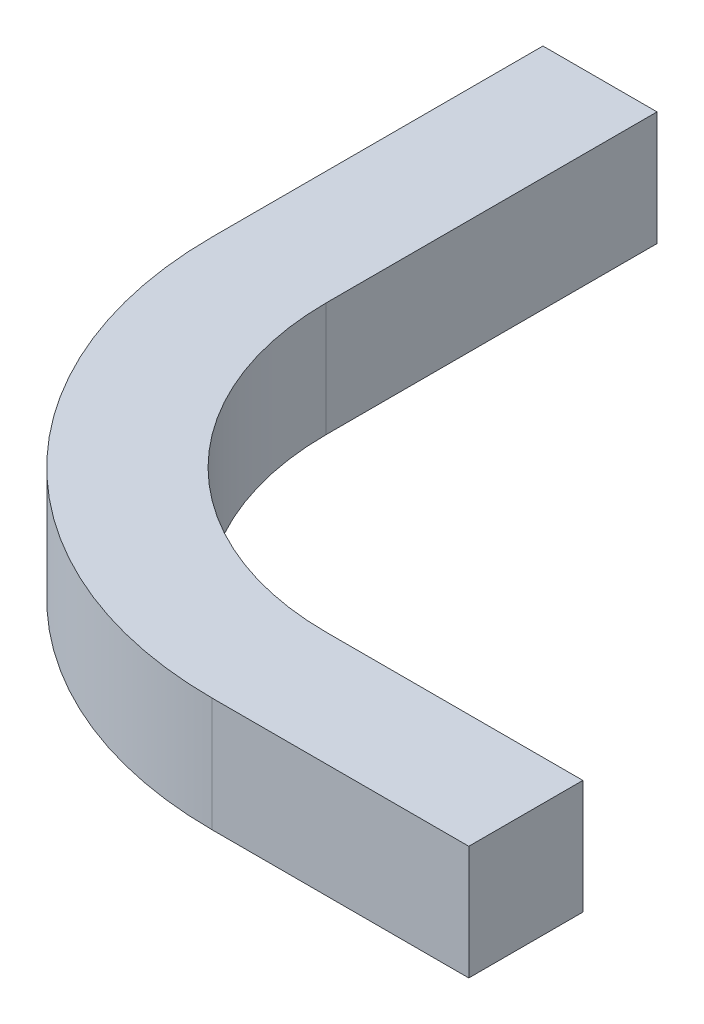
ISO-10303-21;
HEADER;
FILE_DESCRIPTION(('STEP AP214'),'2;1');
FILE_NAME('part.step','',(''),(''),'','','');
FILE_SCHEMA(('AUTOMOTIVE_DESIGN { 1 0 10303 214 1 1 1 1 }'));
ENDSEC;
DATA;
#1=APPLICATION_CONTEXT('core data for automotive mechanical design processes');
#2=APPLICATION_PROTOCOL_DEFINITION('international standard','automotive_design',2000,#1);
#3=PRODUCT_CONTEXT('',#1,'mechanical');
#4=PRODUCT('Part','Part','',(#3));
#5=PRODUCT_RELATED_PRODUCT_CATEGORY('part','',(#4));
#6=PRODUCT_DEFINITION_FORMATION('','',#4);
#7=PRODUCT_DEFINITION_CONTEXT('part definition',#1,'design');
#8=PRODUCT_DEFINITION('design','',#6,#7);
#9=PRODUCT_DEFINITION_SHAPE('','',#8);
#10=(LENGTH_UNIT() NAMED_UNIT(*) SI_UNIT(.MILLI.,.METRE.));
#11=(NAMED_UNIT(*) PLANE_ANGLE_UNIT() SI_UNIT($,.RADIAN.));
#12=(NAMED_UNIT(*) SI_UNIT($,.STERADIAN.) SOLID_ANGLE_UNIT());
#13=UNCERTAINTY_MEASURE_WITH_UNIT(LENGTH_MEASURE(1.E-05),#10,'distance_accuracy_value','');
#14=(GEOMETRIC_REPRESENTATION_CONTEXT(3) GLOBAL_UNCERTAINTY_ASSIGNED_CONTEXT((#13)) GLOBAL_UNIT_ASSIGNED_CONTEXT((#10,
#11,#12)) REPRESENTATION_CONTEXT('',''));
#15=CARTESIAN_POINT('',(0.,0.,0.));
#16=DIRECTION('',(0.,0.,1.));
#17=DIRECTION('',(1.,0.,0.));
#18=AXIS2_PLACEMENT_3D('',#15,#16,#17);
#19=CARTESIAN_POINT('',(-45.,20.,-9.99999999999999));
#20=DIRECTION('',(0.,0.,1.));
#21=DIRECTION('',(1.,0.,0.));
#22=AXIS2_PLACEMENT_3D('',#19,#20,#21);
#23=PLANE('',#22);
#24=DIRECTION('',(-1.,0.,0.));
#25=VECTOR('',#24,1.);
#26=CARTESIAN_POINT('',(-45.,0.,-9.99999999999999));
#27=LINE('',#26,#25);
#28=CARTESIAN_POINT('',(0.,0.,-10.));
#29=VERTEX_POINT('',#28);
#30=CARTESIAN_POINT('',(-45.,0.,-9.99999999999999));
#31=VERTEX_POINT('',#30);
#32=EDGE_CURVE('E146',#29,#31,#27,.T.);
#33=ORIENTED_EDGE('',*,*,#32,.T.);
#34=DIRECTION('',(0.,-1.,0.));
#35=VECTOR('',#34,1.);
#36=CARTESIAN_POINT('',(-45.,20.,-9.99999999999999));
#37=LINE('',#36,#35);
#38=CARTESIAN_POINT('',(-45.,20.,-9.99999999999999));
#39=VERTEX_POINT('',#38);
#40=EDGE_CURVE('E11',#39,#31,#37,.T.);
#41=ORIENTED_EDGE('',*,*,#40,.F.);
#42=DIRECTION('',(-1.,0.,0.));
#43=VECTOR('',#42,1.);
#44=CARTESIAN_POINT('',(-45.,20.,-9.99999999999999));
#45=LINE('',#44,#43);
#46=CARTESIAN_POINT('',(0.,20.,-10.));
#47=VERTEX_POINT('',#46);
#48=EDGE_CURVE('E168',#47,#39,#45,.T.);
#49=ORIENTED_EDGE('',*,*,#48,.F.);
#50=DIRECTION('',(0.,-1.,0.));
#51=VECTOR('',#50,1.);
#52=CARTESIAN_POINT('',(0.,20.,-10.));
#53=LINE('',#52,#51);
#54=EDGE_CURVE('E142',#47,#29,#53,.T.);
#55=ORIENTED_EDGE('',*,*,#54,.T.);
#56=EDGE_LOOP('',(#33,#41,#49,#55));
#57=FACE_BOUND('',#56,.T.);
#58=ADVANCED_FACE('F45',(#57),#23,.F.);
#59=CARTESIAN_POINT('',(-45.,20.,-60.));
#60=DIRECTION('',(0.,-1.,0.));
#61=DIRECTION('',(0.,0.,-1.));
#62=AXIS2_PLACEMENT_3D('',#59,#60,#61);
#63=CYLINDRICAL_SURFACE('',#62,50.);
#64=CARTESIAN_POINT('',(-45.,0.,-60.));
#65=DIRECTION('',(0.,-1.,0.));
#66=DIRECTION('',(0.,0.,1.));
#67=AXIS2_PLACEMENT_3D('',#64,#65,#66);
#68=CIRCLE('',#67,50.);
#69=CARTESIAN_POINT('',(-95.,0.,-60.));
#70=VERTEX_POINT('',#69);
#71=EDGE_CURVE('E150',#31,#70,#68,.T.);
#72=ORIENTED_EDGE('',*,*,#71,.T.);
#73=DIRECTION('',(0.,-1.,0.));
#74=VECTOR('',#73,1.);
#75=CARTESIAN_POINT('',(-95.,20.,-60.));
#76=LINE('',#75,#74);
#77=CARTESIAN_POINT('',(-95.,20.,-60.));
#78=VERTEX_POINT('',#77);
#79=EDGE_CURVE('E54',#78,#70,#76,.T.);
#80=ORIENTED_EDGE('',*,*,#79,.F.);
#81=CARTESIAN_POINT('',(-45.,20.,-60.));
#82=DIRECTION('',(0.,-1.,0.));
#83=DIRECTION('',(0.,0.,1.));
#84=AXIS2_PLACEMENT_3D('',#81,#82,#83);
#85=CIRCLE('',#84,50.);
#86=EDGE_CURVE('E105',#39,#78,#85,.T.);
#87=ORIENTED_EDGE('',*,*,#86,.F.);
#88=ORIENTED_EDGE('',*,*,#40,.T.);
#89=EDGE_LOOP('',(#72,#80,#87,#88));
#90=FACE_BOUND('',#89,.T.);
#91=ADVANCED_FACE('F214',(#90),#63,.F.);
#92=CARTESIAN_POINT('',(-95.,20.,-118.));
#93=DIRECTION('',(-1.,0.,0.));
#94=DIRECTION('',(0.,0.,1.));
#95=AXIS2_PLACEMENT_3D('',#92,#93,#94);
#96=PLANE('',#95);
#97=DIRECTION('',(0.,0.,-1.));
#98=VECTOR('',#97,1.);
#99=CARTESIAN_POINT('',(-95.,0.,-118.));
#100=LINE('',#99,#98);
#101=CARTESIAN_POINT('',(-95.,0.,-118.));
#102=VERTEX_POINT('',#101);
#103=EDGE_CURVE('E153',#70,#102,#100,.T.);
#104=ORIENTED_EDGE('',*,*,#103,.T.);
#105=DIRECTION('',(0.,-1.,0.));
#106=VECTOR('',#105,1.);
#107=CARTESIAN_POINT('',(-95.,20.,-118.));
#108=LINE('',#107,#106);
#109=CARTESIAN_POINT('',(-95.,20.,-118.));
#110=VERTEX_POINT('',#109);
#111=EDGE_CURVE('E179',#110,#102,#108,.T.);
#112=ORIENTED_EDGE('',*,*,#111,.F.);
#113=DIRECTION('',(0.,0.,-1.));
#114=VECTOR('',#113,1.);
#115=CARTESIAN_POINT('',(-95.,20.,-118.));
#116=LINE('',#115,#114);
#117=EDGE_CURVE('E189',#78,#110,#116,.T.);
#118=ORIENTED_EDGE('',*,*,#117,.F.);
#119=ORIENTED_EDGE('',*,*,#79,.T.);
#120=EDGE_LOOP('',(#104,#112,#118,#119));
#121=FACE_BOUND('',#120,.T.);
#122=ADVANCED_FACE('F187',(#121),#96,.F.);
#123=CARTESIAN_POINT('',(-115.,20.,-118.));
#124=DIRECTION('',(0.,0.,1.));
#125=DIRECTION('',(1.,0.,0.));
#126=AXIS2_PLACEMENT_3D('',#123,#124,#125);
#127=PLANE('',#126);
#128=DIRECTION('',(-1.,0.,0.));
#129=VECTOR('',#128,1.);
#130=CARTESIAN_POINT('',(-115.,0.,-118.));
#131=LINE('',#130,#129);
#132=CARTESIAN_POINT('',(-115.,0.,-118.));
#133=VERTEX_POINT('',#132);
#134=EDGE_CURVE('E156',#102,#133,#131,.T.);
#135=ORIENTED_EDGE('',*,*,#134,.T.);
#136=DIRECTION('',(0.,-1.,0.));
#137=VECTOR('',#136,1.);
#138=CARTESIAN_POINT('',(-115.,20.,-118.));
#139=LINE('',#138,#137);
#140=CARTESIAN_POINT('',(-115.,20.,-118.));
#141=VERTEX_POINT('',#140);
#142=EDGE_CURVE('E175',#141,#133,#139,.T.);
#143=ORIENTED_EDGE('',*,*,#142,.F.);
#144=DIRECTION('',(-1.,0.,0.));
#145=VECTOR('',#144,1.);
#146=CARTESIAN_POINT('',(-115.,20.,-118.));
#147=LINE('',#146,#145);
#148=EDGE_CURVE('E202',#110,#141,#147,.T.);
#149=ORIENTED_EDGE('',*,*,#148,.F.);
#150=ORIENTED_EDGE('',*,*,#111,.T.);
#151=EDGE_LOOP('',(#135,#143,#149,#150));
#152=FACE_BOUND('',#151,.T.);
#153=ADVANCED_FACE('F197',(#152),#127,.F.);
#154=CARTESIAN_POINT('',(-115.,20.,-60.));
#155=DIRECTION('',(1.,0.,0.));
#156=DIRECTION('',(0.,0.,-1.));
#157=AXIS2_PLACEMENT_3D('',#154,#155,#156);
#158=PLANE('',#157);
#159=DIRECTION('',(0.,0.,1.));
#160=VECTOR('',#159,1.);
#161=CARTESIAN_POINT('',(-115.,0.,-60.));
#162=LINE('',#161,#160);
#163=CARTESIAN_POINT('',(-115.,0.,-60.));
#164=VERTEX_POINT('',#163);
#165=EDGE_CURVE('E159',#133,#164,#162,.T.);
#166=ORIENTED_EDGE('',*,*,#165,.T.);
#167=DIRECTION('',(0.,-1.,0.));
#168=VECTOR('',#167,1.);
#169=CARTESIAN_POINT('',(-115.,20.,-60.));
#170=LINE('',#169,#168);
#171=CARTESIAN_POINT('',(-115.,20.,-60.));
#172=VERTEX_POINT('',#171);
#173=EDGE_CURVE('E135',#172,#164,#170,.T.);
#174=ORIENTED_EDGE('',*,*,#173,.F.);
#175=DIRECTION('',(0.,0.,1.));
#176=VECTOR('',#175,1.);
#177=CARTESIAN_POINT('',(-115.,20.,-60.));
#178=LINE('',#177,#176);
#179=EDGE_CURVE('E124',#141,#172,#178,.T.);
#180=ORIENTED_EDGE('',*,*,#179,.F.);
#181=ORIENTED_EDGE('',*,*,#142,.T.);
#182=EDGE_LOOP('',(#166,#174,#180,#181));
#183=FACE_BOUND('',#182,.T.);
#184=ADVANCED_FACE('F200',(#183),#158,.F.);
#185=CARTESIAN_POINT('',(-45.,20.,-60.));
#186=DIRECTION('',(0.,-1.,0.));
#187=DIRECTION('',(0.,0.,-1.));
#188=AXIS2_PLACEMENT_3D('',#185,#186,#187);
#189=CYLINDRICAL_SURFACE('',#188,70.);
#190=CARTESIAN_POINT('',(-45.,0.,-60.));
#191=DIRECTION('',(0.,1.,0.));
#192=DIRECTION('',(0.,0.,1.));
#193=AXIS2_PLACEMENT_3D('',#190,#191,#192);
#194=CIRCLE('',#193,70.);
#195=CARTESIAN_POINT('',(-45.,0.,9.99999999999998));
#196=VERTEX_POINT('',#195);
#197=EDGE_CURVE('E133',#164,#196,#194,.T.);
#198=ORIENTED_EDGE('',*,*,#197,.T.);
#199=DIRECTION('',(0.,-1.,0.));
#200=VECTOR('',#199,1.);
#201=CARTESIAN_POINT('',(-45.,20.,9.99999999999998));
#202=LINE('',#201,#200);
#203=CARTESIAN_POINT('',(-45.,20.,9.99999999999998));
#204=VERTEX_POINT('',#203);
#205=EDGE_CURVE('E130',#204,#196,#202,.T.);
#206=ORIENTED_EDGE('',*,*,#205,.F.);
#207=CARTESIAN_POINT('',(-45.,20.,-60.));
#208=DIRECTION('',(0.,1.,0.));
#209=DIRECTION('',(0.,0.,1.));
#210=AXIS2_PLACEMENT_3D('',#207,#208,#209);
#211=CIRCLE('',#210,70.);
#212=EDGE_CURVE('E118',#172,#204,#211,.T.);
#213=ORIENTED_EDGE('',*,*,#212,.F.);
#214=ORIENTED_EDGE('',*,*,#173,.T.);
#215=EDGE_LOOP('',(#198,#206,#213,#214));
#216=FACE_BOUND('',#215,.T.);
#217=ADVANCED_FACE('F131',(#216),#189,.T.);
#218=CARTESIAN_POINT('',(0.,20.,10.));
#219=DIRECTION('',(0.,0.,-1.));
#220=DIRECTION('',(-1.,0.,0.));
#221=AXIS2_PLACEMENT_3D('',#218,#219,#220);
#222=PLANE('',#221);
#223=DIRECTION('',(1.,0.,0.));
#224=VECTOR('',#223,1.);
#225=CARTESIAN_POINT('',(0.,0.,10.));
#226=LINE('',#225,#224);
#227=CARTESIAN_POINT('',(0.,0.,10.));
#228=VERTEX_POINT('',#227);
#229=EDGE_CURVE('E91',#196,#228,#226,.T.);
#230=ORIENTED_EDGE('',*,*,#229,.T.);
#231=DIRECTION('',(0.,-1.,0.));
#232=VECTOR('',#231,1.);
#233=CARTESIAN_POINT('',(0.,20.,10.));
#234=LINE('',#233,#232);
#235=CARTESIAN_POINT('',(0.,20.,10.));
#236=VERTEX_POINT('',#235);
#237=EDGE_CURVE('E136',#236,#228,#234,.T.);
#238=ORIENTED_EDGE('',*,*,#237,.F.);
#239=DIRECTION('',(1.,0.,0.));
#240=VECTOR('',#239,1.);
#241=CARTESIAN_POINT('',(0.,20.,10.));
#242=LINE('',#241,#240);
#243=EDGE_CURVE('E122',#204,#236,#242,.T.);
#244=ORIENTED_EDGE('',*,*,#243,.F.);
#245=ORIENTED_EDGE('',*,*,#205,.T.);
#246=EDGE_LOOP('',(#230,#238,#244,#245));
#247=FACE_BOUND('',#246,.T.);
#248=ADVANCED_FACE('F138',(#247),#222,.F.);
#249=CARTESIAN_POINT('',(0.,20.,-10.));
#250=DIRECTION('',(-1.,0.,0.));
#251=DIRECTION('',(0.,0.,1.));
#252=AXIS2_PLACEMENT_3D('',#249,#250,#251);
#253=PLANE('',#252);
#254=DIRECTION('',(0.,0.,-1.));
#255=VECTOR('',#254,1.);
#256=CARTESIAN_POINT('',(0.,0.,-10.));
#257=LINE('',#256,#255);
#258=EDGE_CURVE('E97',#228,#29,#257,.T.);
#259=ORIENTED_EDGE('',*,*,#258,.T.);
#260=ORIENTED_EDGE('',*,*,#54,.F.);
#261=DIRECTION('',(0.,0.,-1.));
#262=VECTOR('',#261,1.);
#263=CARTESIAN_POINT('',(0.,20.,-10.));
#264=LINE('',#263,#262);
#265=EDGE_CURVE('E62',#236,#47,#264,.T.);
#266=ORIENTED_EDGE('',*,*,#265,.F.);
#267=ORIENTED_EDGE('',*,*,#237,.T.);
#268=EDGE_LOOP('',(#259,#260,#266,#267));
#269=FACE_BOUND('',#268,.T.);
#270=ADVANCED_FACE('F230',(#269),#253,.F.);
#271=CARTESIAN_POINT('',(-45.,20.,-60.));
#272=DIRECTION('',(0.,1.,0.));
#273=DIRECTION('',(0.,0.,1.));
#274=AXIS2_PLACEMENT_3D('',#271,#272,#273);
#275=PLANE('',#274);
#276=ORIENTED_EDGE('',*,*,#48,.T.);
#277=ORIENTED_EDGE('',*,*,#86,.T.);
#278=ORIENTED_EDGE('',*,*,#117,.T.);
#279=ORIENTED_EDGE('',*,*,#148,.T.);
#280=ORIENTED_EDGE('',*,*,#179,.T.);
#281=ORIENTED_EDGE('',*,*,#212,.T.);
#282=ORIENTED_EDGE('',*,*,#243,.T.);
#283=ORIENTED_EDGE('',*,*,#265,.T.);
#284=EDGE_LOOP('',(#276,#277,#278,#279,#280,#281,#282,#283));
#285=FACE_BOUND('',#284,.T.);
#286=ADVANCED_FACE('F120',(#285),#275,.T.);
#287=CARTESIAN_POINT('',(-45.,0.,-60.));
#288=DIRECTION('',(0.,1.,0.));
#289=DIRECTION('',(0.,0.,1.));
#290=AXIS2_PLACEMENT_3D('',#287,#288,#289);
#291=PLANE('',#290);
#292=ORIENTED_EDGE('',*,*,#32,.F.);
#293=ORIENTED_EDGE('',*,*,#258,.F.);
#294=ORIENTED_EDGE('',*,*,#229,.F.);
#295=ORIENTED_EDGE('',*,*,#197,.F.);
#296=ORIENTED_EDGE('',*,*,#165,.F.);
#297=ORIENTED_EDGE('',*,*,#134,.F.);
#298=ORIENTED_EDGE('',*,*,#103,.F.);
#299=ORIENTED_EDGE('',*,*,#71,.F.);
#300=EDGE_LOOP('',(#292,#293,#294,#295,#296,#297,#298,#299));
#301=FACE_BOUND('',#300,.T.);
#302=ADVANCED_FACE('F193',(#301),#291,.F.);
#303=CLOSED_SHELL('',(#58,#91,#122,#153,#184,#217,#248,#270,#286,#302));
#304=MANIFOLD_SOLID_BREP('B2',#303);
#305=ADVANCED_BREP_SHAPE_REPRESENTATION('',(#18,#304),#14);
#306=SHAPE_DEFINITION_REPRESENTATION(#9,#305);
ENDSEC;
END-ISO-10303-21;
